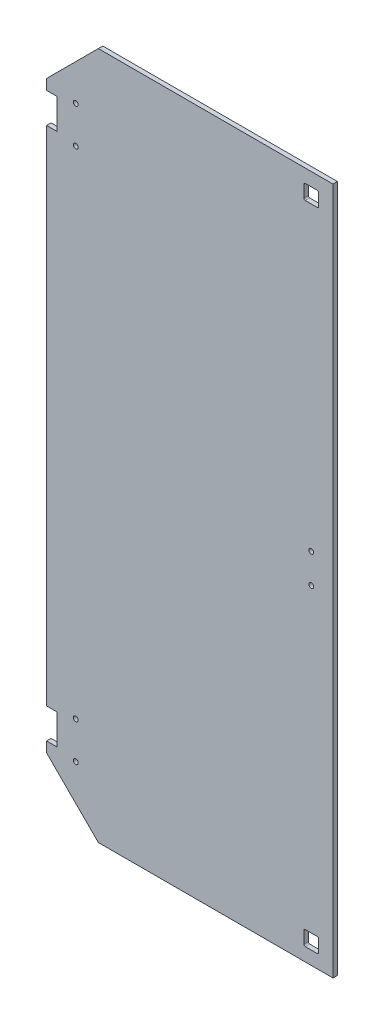
ISO-10303-21;
HEADER;
FILE_DESCRIPTION(('STEP AP214'),'2;1');
FILE_NAME('part.step','',(''),(''),'','','');
FILE_SCHEMA(('AUTOMOTIVE_DESIGN { 1 0 10303 214 1 1 1 1 }'));
ENDSEC;
DATA;
#1=APPLICATION_CONTEXT('core data for automotive mechanical design processes');
#2=APPLICATION_PROTOCOL_DEFINITION('international standard','automotive_design',2000,#1);
#3=PRODUCT_CONTEXT('',#1,'mechanical');
#4=PRODUCT('Part','Part','',(#3));
#5=PRODUCT_RELATED_PRODUCT_CATEGORY('part','',(#4));
#6=PRODUCT_DEFINITION_FORMATION('','',#4);
#7=PRODUCT_DEFINITION_CONTEXT('part definition',#1,'design');
#8=PRODUCT_DEFINITION('design','',#6,#7);
#9=PRODUCT_DEFINITION_SHAPE('','',#8);
#10=(LENGTH_UNIT() NAMED_UNIT(*) SI_UNIT(.MILLI.,.METRE.));
#11=(NAMED_UNIT(*) PLANE_ANGLE_UNIT() SI_UNIT($,.RADIAN.));
#12=(NAMED_UNIT(*) SI_UNIT($,.STERADIAN.) SOLID_ANGLE_UNIT());
#13=UNCERTAINTY_MEASURE_WITH_UNIT(LENGTH_MEASURE(1.E-05),#10,'distance_accuracy_value','');
#14=(GEOMETRIC_REPRESENTATION_CONTEXT(3) GLOBAL_UNCERTAINTY_ASSIGNED_CONTEXT((#13)) GLOBAL_UNIT_ASSIGNED_CONTEXT((#10,
#11,#12)) REPRESENTATION_CONTEXT('',''));
#15=CARTESIAN_POINT('',(0.,0.,0.));
#16=DIRECTION('',(0.,0.,1.));
#17=DIRECTION('',(1.,0.,0.));
#18=AXIS2_PLACEMENT_3D('',#15,#16,#17);
#19=CARTESIAN_POINT('',(0.,0.,3.));
#20=DIRECTION('',(0.,0.,1.));
#21=DIRECTION('',(1.,0.,0.));
#22=AXIS2_PLACEMENT_3D('',#19,#20,#21);
#23=PLANE('',#22);
#24=CARTESIAN_POINT('',(-11.,222.5,3.));
#25=DIRECTION('',(0.,0.,-1.));
#26=DIRECTION('',(1.,0.,0.));
#27=AXIS2_PLACEMENT_3D('',#24,#25,#26);
#28=CIRCLE('',#27,1.);
#29=CARTESIAN_POINT('',(-11.,223.5,3.));
#30=VERTEX_POINT('',#29);
#31=CARTESIAN_POINT('',(-10.,222.5,3.));
#32=VERTEX_POINT('',#31);
#33=EDGE_CURVE('E422',#30,#32,#28,.T.);
#34=ORIENTED_EDGE('',*,*,#33,.T.);
#35=DIRECTION('',(0.,-1.,0.));
#36=VECTOR('',#35,1.);
#37=CARTESIAN_POINT('',(-10.,222.5,3.));
#38=LINE('',#37,#36);
#39=CARTESIAN_POINT('',(-10.,214.5,3.));
#40=VERTEX_POINT('',#39);
#41=EDGE_CURVE('E418',#32,#40,#38,.T.);
#42=ORIENTED_EDGE('',*,*,#41,.T.);
#43=CARTESIAN_POINT('',(-11.,214.5,3.));
#44=DIRECTION('',(0.,0.,-1.));
#45=DIRECTION('',(1.,0.,0.));
#46=AXIS2_PLACEMENT_3D('',#43,#44,#45);
#47=CIRCLE('',#46,1.);
#48=CARTESIAN_POINT('',(-11.,213.5,3.));
#49=VERTEX_POINT('',#48);
#50=EDGE_CURVE('E444',#40,#49,#47,.T.);
#51=ORIENTED_EDGE('',*,*,#50,.T.);
#52=DIRECTION('',(-1.,0.,0.));
#53=VECTOR('',#52,1.);
#54=CARTESIAN_POINT('',(-11.,213.5,3.));
#55=LINE('',#54,#53);
#56=CARTESIAN_POINT('',(-19.,213.5,3.));
#57=VERTEX_POINT('',#56);
#58=EDGE_CURVE('E447',#49,#57,#55,.T.);
#59=ORIENTED_EDGE('',*,*,#58,.T.);
#60=CARTESIAN_POINT('',(-19.,214.5,3.));
#61=DIRECTION('',(0.,0.,-1.));
#62=DIRECTION('',(1.,0.,0.));
#63=AXIS2_PLACEMENT_3D('',#60,#61,#62);
#64=CIRCLE('',#63,1.);
#65=CARTESIAN_POINT('',(-20.,214.5,3.));
#66=VERTEX_POINT('',#65);
#67=EDGE_CURVE('E450',#57,#66,#64,.T.);
#68=ORIENTED_EDGE('',*,*,#67,.T.);
#69=DIRECTION('',(0.,1.,0.));
#70=VECTOR('',#69,1.);
#71=CARTESIAN_POINT('',(-20.,222.5,3.));
#72=LINE('',#71,#70);
#73=CARTESIAN_POINT('',(-20.,222.5,3.));
#74=VERTEX_POINT('',#73);
#75=EDGE_CURVE('E453',#66,#74,#72,.T.);
#76=ORIENTED_EDGE('',*,*,#75,.T.);
#77=CARTESIAN_POINT('',(-19.,222.5,3.));
#78=DIRECTION('',(0.,0.,-1.));
#79=DIRECTION('',(-1.,0.,0.));
#80=AXIS2_PLACEMENT_3D('',#77,#78,#79);
#81=CIRCLE('',#80,1.);
#82=CARTESIAN_POINT('',(-19.,223.5,3.));
#83=VERTEX_POINT('',#82);
#84=EDGE_CURVE('E456',#74,#83,#81,.T.);
#85=ORIENTED_EDGE('',*,*,#84,.T.);
#86=DIRECTION('',(1.,0.,0.));
#87=VECTOR('',#86,1.);
#88=CARTESIAN_POINT('',(-11.,223.5,3.));
#89=LINE('',#88,#87);
#90=EDGE_CURVE('E459',#83,#30,#89,.T.);
#91=ORIENTED_EDGE('',*,*,#90,.T.);
#92=EDGE_LOOP('',(#34,#42,#51,#59,#68,#76,#85,#91));
#93=FACE_BOUND('',#92,.T.);
#94=CARTESIAN_POINT('',(-15.,10.,3.));
#95=DIRECTION('',(0.,0.,1.));
#96=DIRECTION('',(1.,0.,0.));
#97=AXIS2_PLACEMENT_3D('',#94,#95,#96);
#98=CIRCLE('',#97,1.65);
#99=CARTESIAN_POINT('',(-13.35,10.,3.));
#100=VERTEX_POINT('',#99);
#101=EDGE_CURVE('E328',#100,#100,#98,.T.);
#102=ORIENTED_EDGE('',*,*,#101,.F.);
#103=EDGE_LOOP('',(#102));
#104=FACE_BOUND('',#103,.T.);
#105=CARTESIAN_POINT('',(-15.,-10.,3.));
#106=DIRECTION('',(0.,0.,1.));
#107=DIRECTION('',(1.,0.,0.));
#108=AXIS2_PLACEMENT_3D('',#105,#106,#107);
#109=CIRCLE('',#108,1.65);
#110=CARTESIAN_POINT('',(-13.35,-10.,3.));
#111=VERTEX_POINT('',#110);
#112=EDGE_CURVE('E334',#111,#111,#109,.T.);
#113=ORIENTED_EDGE('',*,*,#112,.F.);
#114=EDGE_LOOP('',(#113));
#115=FACE_BOUND('',#114,.T.);
#116=CARTESIAN_POINT('',(-174.25,-192.75,3.));
#117=DIRECTION('',(0.,0.,1.));
#118=DIRECTION('',(1.,0.,0.));
#119=AXIS2_PLACEMENT_3D('',#116,#117,#118);
#120=CIRCLE('',#119,1.65);
#121=CARTESIAN_POINT('',(-172.6,-192.75,3.));
#122=VERTEX_POINT('',#121);
#123=EDGE_CURVE('E310',#122,#122,#120,.T.);
#124=ORIENTED_EDGE('',*,*,#123,.F.);
#125=EDGE_LOOP('',(#124));
#126=FACE_BOUND('',#125,.T.);
#127=CARTESIAN_POINT('',(-174.25,192.75,3.));
#128=DIRECTION('',(0.,0.,1.));
#129=DIRECTION('',(-1.,0.,0.));
#130=AXIS2_PLACEMENT_3D('',#127,#128,#129);
#131=CIRCLE('',#130,1.65);
#132=CARTESIAN_POINT('',(-175.9,192.75,3.));
#133=VERTEX_POINT('',#132);
#134=EDGE_CURVE('E316',#133,#133,#131,.T.);
#135=ORIENTED_EDGE('',*,*,#134,.F.);
#136=EDGE_LOOP('',(#135));
#137=FACE_BOUND('',#136,.T.);
#138=CARTESIAN_POINT('',(-174.25,167.75,3.));
#139=DIRECTION('',(0.,0.,1.));
#140=DIRECTION('',(-1.,0.,0.));
#141=AXIS2_PLACEMENT_3D('',#138,#139,#140);
#142=CIRCLE('',#141,1.65);
#143=CARTESIAN_POINT('',(-175.9,167.75,3.));
#144=VERTEX_POINT('',#143);
#145=EDGE_CURVE('E317',#144,#144,#142,.T.);
#146=ORIENTED_EDGE('',*,*,#145,.F.);
#147=EDGE_LOOP('',(#146));
#148=FACE_BOUND('',#147,.T.);
#149=CARTESIAN_POINT('',(-174.25,-167.75,3.));
#150=DIRECTION('',(0.,0.,1.));
#151=DIRECTION('',(1.,0.,0.));
#152=AXIS2_PLACEMENT_3D('',#149,#150,#151);
#153=CIRCLE('',#152,1.65);
#154=CARTESIAN_POINT('',(-172.6,-167.75,3.));
#155=VERTEX_POINT('',#154);
#156=EDGE_CURVE('E304',#155,#155,#153,.T.);
#157=ORIENTED_EDGE('',*,*,#156,.F.);
#158=EDGE_LOOP('',(#157));
#159=FACE_BOUND('',#158,.T.);
#160=DIRECTION('',(0.,1.,0.));
#161=VECTOR('',#160,1.);
#162=CARTESIAN_POINT('',(-10.,-222.5,3.));
#163=LINE('',#162,#161);
#164=CARTESIAN_POINT('',(-10.,-222.5,3.));
#165=VERTEX_POINT('',#164);
#166=CARTESIAN_POINT('',(-10.,-214.5,3.));
#167=VERTEX_POINT('',#166);
#168=EDGE_CURVE('E399',#165,#167,#163,.T.);
#169=ORIENTED_EDGE('',*,*,#168,.F.);
#170=CARTESIAN_POINT('',(-11.,-222.5,3.));
#171=DIRECTION('',(0.,0.,1.));
#172=DIRECTION('',(1.,0.,0.));
#173=AXIS2_PLACEMENT_3D('',#170,#171,#172);
#174=CIRCLE('',#173,1.);
#175=CARTESIAN_POINT('',(-11.,-223.5,3.));
#176=VERTEX_POINT('',#175);
#177=EDGE_CURVE('E364',#176,#165,#174,.T.);
#178=ORIENTED_EDGE('',*,*,#177,.F.);
#179=DIRECTION('',(1.,0.,0.));
#180=VECTOR('',#179,1.);
#181=CARTESIAN_POINT('',(-11.,-223.5,3.));
#182=LINE('',#181,#180);
#183=CARTESIAN_POINT('',(-19.,-223.5,3.));
#184=VERTEX_POINT('',#183);
#185=EDGE_CURVE('E360',#184,#176,#182,.T.);
#186=ORIENTED_EDGE('',*,*,#185,.F.);
#187=CARTESIAN_POINT('',(-19.,-222.5,3.));
#188=DIRECTION('',(0.,0.,1.));
#189=DIRECTION('',(-1.,0.,0.));
#190=AXIS2_PLACEMENT_3D('',#187,#188,#189);
#191=CIRCLE('',#190,1.);
#192=CARTESIAN_POINT('',(-20.,-222.5,3.));
#193=VERTEX_POINT('',#192);
#194=EDGE_CURVE('E388',#193,#184,#191,.T.);
#195=ORIENTED_EDGE('',*,*,#194,.F.);
#196=DIRECTION('',(0.,-1.,0.));
#197=VECTOR('',#196,1.);
#198=CARTESIAN_POINT('',(-20.,-222.5,3.));
#199=LINE('',#198,#197);
#200=CARTESIAN_POINT('',(-20.,-214.5,3.));
#201=VERTEX_POINT('',#200);
#202=EDGE_CURVE('E391',#201,#193,#199,.T.);
#203=ORIENTED_EDGE('',*,*,#202,.F.);
#204=CARTESIAN_POINT('',(-19.,-214.5,3.));
#205=DIRECTION('',(0.,0.,1.));
#206=DIRECTION('',(1.,0.,0.));
#207=AXIS2_PLACEMENT_3D('',#204,#205,#206);
#208=CIRCLE('',#207,1.);
#209=CARTESIAN_POINT('',(-19.,-213.5,3.));
#210=VERTEX_POINT('',#209);
#211=EDGE_CURVE('E393',#210,#201,#208,.T.);
#212=ORIENTED_EDGE('',*,*,#211,.F.);
#213=DIRECTION('',(-1.,0.,0.));
#214=VECTOR('',#213,1.);
#215=CARTESIAN_POINT('',(-11.,-213.5,3.));
#216=LINE('',#215,#214);
#217=CARTESIAN_POINT('',(-11.,-213.5,3.));
#218=VERTEX_POINT('',#217);
#219=EDGE_CURVE('E395',#218,#210,#216,.T.);
#220=ORIENTED_EDGE('',*,*,#219,.F.);
#221=CARTESIAN_POINT('',(-11.,-214.5,3.));
#222=DIRECTION('',(0.,0.,1.));
#223=DIRECTION('',(1.,0.,0.));
#224=AXIS2_PLACEMENT_3D('',#221,#222,#223);
#225=CIRCLE('',#224,1.);
#226=EDGE_CURVE('E397',#167,#218,#225,.T.);
#227=ORIENTED_EDGE('',*,*,#226,.F.);
#228=EDGE_LOOP('',(#169,#178,#186,#195,#203,#212,#220,#227));
#229=FACE_BOUND('',#228,.T.);
#230=DIRECTION('',(0.,1.,0.));
#231=VECTOR('',#230,1.);
#232=CARTESIAN_POINT('',(-186.8,190.5,3.));
#233=LINE('',#232,#231);
#234=CARTESIAN_POINT('',(-186.8,170.,3.));
#235=VERTEX_POINT('',#234);
#236=CARTESIAN_POINT('',(-186.8,190.5,3.));
#237=VERTEX_POINT('',#236);
#238=EDGE_CURVE('E233',#235,#237,#233,.T.);
#239=ORIENTED_EDGE('',*,*,#238,.F.);
#240=DIRECTION('',(1.,0.,0.));
#241=VECTOR('',#240,1.);
#242=CARTESIAN_POINT('',(-194.,170.,3.));
#243=LINE('',#242,#241);
#244=CARTESIAN_POINT('',(-194.,170.,3.));
#245=VERTEX_POINT('',#244);
#246=EDGE_CURVE('E218',#245,#235,#243,.T.);
#247=ORIENTED_EDGE('',*,*,#246,.F.);
#248=DIRECTION('',(0.,-1.,0.));
#249=VECTOR('',#248,1.);
#250=CARTESIAN_POINT('',(-194.,-232.5,3.));
#251=LINE('',#250,#249);
#252=CARTESIAN_POINT('',(-194.,-170.,3.));
#253=VERTEX_POINT('',#252);
#254=EDGE_CURVE('E232',#245,#253,#251,.T.);
#255=ORIENTED_EDGE('',*,*,#254,.T.);
#256=DIRECTION('',(-1.,0.,0.));
#257=VECTOR('',#256,1.);
#258=CARTESIAN_POINT('',(-194.,-170.,3.));
#259=LINE('',#258,#257);
#260=CARTESIAN_POINT('',(-186.8,-170.,3.));
#261=VERTEX_POINT('',#260);
#262=EDGE_CURVE('E33',#261,#253,#259,.T.);
#263=ORIENTED_EDGE('',*,*,#262,.F.);
#264=DIRECTION('',(0.,1.,0.));
#265=VECTOR('',#264,1.);
#266=CARTESIAN_POINT('',(-186.8,-190.5,3.));
#267=LINE('',#266,#265);
#268=CARTESIAN_POINT('',(-186.8,-190.5,3.));
#269=VERTEX_POINT('',#268);
#270=EDGE_CURVE('E483',#269,#261,#267,.T.);
#271=ORIENTED_EDGE('',*,*,#270,.F.);
#272=DIRECTION('',(1.,0.,0.));
#273=VECTOR('',#272,1.);
#274=CARTESIAN_POINT('',(-194.,-190.5,3.));
#275=LINE('',#274,#273);
#276=CARTESIAN_POINT('',(-194.,-190.5,3.));
#277=VERTEX_POINT('',#276);
#278=EDGE_CURVE('E476',#277,#269,#275,.T.);
#279=ORIENTED_EDGE('',*,*,#278,.F.);
#280=CARTESIAN_POINT('',(-194.,-197.5,3.));
#281=VERTEX_POINT('',#280);
#282=EDGE_CURVE('E239',#277,#281,#251,.T.);
#283=ORIENTED_EDGE('',*,*,#282,.T.);
#284=DIRECTION('',(-0.707106781186547,0.707106781186549,0.));
#285=VECTOR('',#284,1.);
#286=CARTESIAN_POINT('',(-195.75,-195.75,3.));
#287=LINE('',#286,#285);
#288=CARTESIAN_POINT('',(-159.,-232.5,3.));
#289=VERTEX_POINT('',#288);
#290=EDGE_CURVE('E26',#281,#289,#287,.F.);
#291=ORIENTED_EDGE('',*,*,#290,.T.);
#292=DIRECTION('',(1.,0.,0.));
#293=VECTOR('',#292,1.);
#294=CARTESIAN_POINT('',(194.,-232.5,3.));
#295=LINE('',#294,#293);
#296=CARTESIAN_POINT('',(-0.299999999999967,-232.5,3.));
#297=VERTEX_POINT('',#296);
#298=EDGE_CURVE('E242',#289,#297,#295,.T.);
#299=ORIENTED_EDGE('',*,*,#298,.T.);
#300=DIRECTION('',(0.,-1.,0.));
#301=VECTOR('',#300,1.);
#302=CARTESIAN_POINT('',(-0.300000000000025,232.5,3.));
#303=LINE('',#302,#301);
#304=CARTESIAN_POINT('',(-0.300000000000025,232.5,3.));
#305=VERTEX_POINT('',#304);
#306=EDGE_CURVE('E303',#305,#297,#303,.T.);
#307=ORIENTED_EDGE('',*,*,#306,.F.);
#308=DIRECTION('',(-1.,0.,0.));
#309=VECTOR('',#308,1.);
#310=CARTESIAN_POINT('',(194.,232.5,3.));
#311=LINE('',#310,#309);
#312=CARTESIAN_POINT('',(-159.,232.5,3.));
#313=VERTEX_POINT('',#312);
#314=EDGE_CURVE('E249',#305,#313,#311,.T.);
#315=ORIENTED_EDGE('',*,*,#314,.T.);
#316=DIRECTION('',(0.707106781186549,0.707106781186547,0.));
#317=VECTOR('',#316,1.);
#318=CARTESIAN_POINT('',(-195.75,195.75,3.));
#319=LINE('',#318,#317);
#320=CARTESIAN_POINT('',(-194.,197.5,3.));
#321=VERTEX_POINT('',#320);
#322=EDGE_CURVE('E277',#313,#321,#319,.F.);
#323=ORIENTED_EDGE('',*,*,#322,.T.);
#324=CARTESIAN_POINT('',(-194.,190.5,3.));
#325=VERTEX_POINT('',#324);
#326=EDGE_CURVE('E238',#321,#325,#251,.T.);
#327=ORIENTED_EDGE('',*,*,#326,.T.);
#328=DIRECTION('',(-1.,0.,0.));
#329=VECTOR('',#328,1.);
#330=CARTESIAN_POINT('',(-194.,190.5,3.));
#331=LINE('',#330,#329);
#332=EDGE_CURVE('E41',#237,#325,#331,.T.);
#333=ORIENTED_EDGE('',*,*,#332,.F.);
#334=EDGE_LOOP('',(#239,#247,#255,#263,#271,#279,#283,#291,#299,#307,#315,#323,#327,#333));
#335=FACE_BOUND('',#334,.T.);
#336=ADVANCED_FACE('F17',(#93,#104,#115,#126,#137,#148,#159,#229,#335),#23,.T.);
#337=CARTESIAN_POINT('',(0.,0.,0.));
#338=DIRECTION('',(0.,0.,1.));
#339=DIRECTION('',(1.,0.,0.));
#340=AXIS2_PLACEMENT_3D('',#337,#338,#339);
#341=PLANE('',#340);
#342=DIRECTION('',(0.,-1.,0.));
#343=VECTOR('',#342,1.);
#344=CARTESIAN_POINT('',(-10.,222.5,0.));
#345=LINE('',#344,#343);
#346=CARTESIAN_POINT('',(-10.,222.5,0.));
#347=VERTEX_POINT('',#346);
#348=CARTESIAN_POINT('',(-10.,214.5,0.));
#349=VERTEX_POINT('',#348);
#350=EDGE_CURVE('E419',#347,#349,#345,.T.);
#351=ORIENTED_EDGE('',*,*,#350,.F.);
#352=CARTESIAN_POINT('',(-11.,222.5,0.));
#353=DIRECTION('',(0.,0.,-1.));
#354=DIRECTION('',(1.,0.,0.));
#355=AXIS2_PLACEMENT_3D('',#352,#353,#354);
#356=CIRCLE('',#355,1.);
#357=CARTESIAN_POINT('',(-11.,223.5,0.));
#358=VERTEX_POINT('',#357);
#359=EDGE_CURVE('E226',#358,#347,#356,.T.);
#360=ORIENTED_EDGE('',*,*,#359,.F.);
#361=DIRECTION('',(1.,0.,0.));
#362=VECTOR('',#361,1.);
#363=CARTESIAN_POINT('',(-11.,223.5,0.));
#364=LINE('',#363,#362);
#365=CARTESIAN_POINT('',(-19.,223.5,0.));
#366=VERTEX_POINT('',#365);
#367=EDGE_CURVE('E438',#366,#358,#364,.T.);
#368=ORIENTED_EDGE('',*,*,#367,.F.);
#369=CARTESIAN_POINT('',(-19.,222.5,0.));
#370=DIRECTION('',(0.,0.,-1.));
#371=DIRECTION('',(-1.,0.,0.));
#372=AXIS2_PLACEMENT_3D('',#369,#370,#371);
#373=CIRCLE('',#372,1.);
#374=CARTESIAN_POINT('',(-20.,222.5,0.));
#375=VERTEX_POINT('',#374);
#376=EDGE_CURVE('E435',#375,#366,#373,.T.);
#377=ORIENTED_EDGE('',*,*,#376,.F.);
#378=DIRECTION('',(0.,1.,0.));
#379=VECTOR('',#378,1.);
#380=CARTESIAN_POINT('',(-20.,222.5,0.));
#381=LINE('',#380,#379);
#382=CARTESIAN_POINT('',(-20.,214.5,0.));
#383=VERTEX_POINT('',#382);
#384=EDGE_CURVE('E432',#383,#375,#381,.T.);
#385=ORIENTED_EDGE('',*,*,#384,.F.);
#386=CARTESIAN_POINT('',(-19.,214.5,0.));
#387=DIRECTION('',(0.,0.,-1.));
#388=DIRECTION('',(1.,0.,0.));
#389=AXIS2_PLACEMENT_3D('',#386,#387,#388);
#390=CIRCLE('',#389,1.);
#391=CARTESIAN_POINT('',(-19.,213.5,0.));
#392=VERTEX_POINT('',#391);
#393=EDGE_CURVE('E429',#392,#383,#390,.T.);
#394=ORIENTED_EDGE('',*,*,#393,.F.);
#395=DIRECTION('',(-1.,0.,0.));
#396=VECTOR('',#395,1.);
#397=CARTESIAN_POINT('',(-11.,213.5,0.));
#398=LINE('',#397,#396);
#399=CARTESIAN_POINT('',(-11.,213.5,0.));
#400=VERTEX_POINT('',#399);
#401=EDGE_CURVE('E426',#400,#392,#398,.T.);
#402=ORIENTED_EDGE('',*,*,#401,.F.);
#403=CARTESIAN_POINT('',(-11.,214.5,0.));
#404=DIRECTION('',(0.,0.,-1.));
#405=DIRECTION('',(1.,0.,0.));
#406=AXIS2_PLACEMENT_3D('',#403,#404,#405);
#407=CIRCLE('',#406,1.);
#408=EDGE_CURVE('E423',#349,#400,#407,.T.);
#409=ORIENTED_EDGE('',*,*,#408,.F.);
#410=EDGE_LOOP('',(#351,#360,#368,#377,#385,#394,#402,#409));
#411=FACE_BOUND('',#410,.T.);
#412=CARTESIAN_POINT('',(-174.25,-167.75,0.));
#413=DIRECTION('',(0.,0.,1.));
#414=DIRECTION('',(1.,0.,0.));
#415=AXIS2_PLACEMENT_3D('',#412,#413,#414);
#416=CIRCLE('',#415,1.65);
#417=CARTESIAN_POINT('',(-172.6,-167.75,0.));
#418=VERTEX_POINT('',#417);
#419=EDGE_CURVE('E307',#418,#418,#416,.T.);
#420=ORIENTED_EDGE('',*,*,#419,.T.);
#421=EDGE_LOOP('',(#420));
#422=FACE_BOUND('',#421,.T.);
#423=CARTESIAN_POINT('',(-174.25,167.75,0.));
#424=DIRECTION('',(0.,0.,1.));
#425=DIRECTION('',(-1.,0.,0.));
#426=AXIS2_PLACEMENT_3D('',#423,#424,#425);
#427=CIRCLE('',#426,1.65);
#428=CARTESIAN_POINT('',(-175.9,167.75,0.));
#429=VERTEX_POINT('',#428);
#430=EDGE_CURVE('E325',#429,#429,#427,.T.);
#431=ORIENTED_EDGE('',*,*,#430,.T.);
#432=EDGE_LOOP('',(#431));
#433=FACE_BOUND('',#432,.T.);
#434=CARTESIAN_POINT('',(-174.25,192.75,0.));
#435=DIRECTION('',(0.,0.,1.));
#436=DIRECTION('',(-1.,0.,0.));
#437=AXIS2_PLACEMENT_3D('',#434,#435,#436);
#438=CIRCLE('',#437,1.65);
#439=CARTESIAN_POINT('',(-175.9,192.75,0.));
#440=VERTEX_POINT('',#439);
#441=EDGE_CURVE('E313',#440,#440,#438,.T.);
#442=ORIENTED_EDGE('',*,*,#441,.T.);
#443=EDGE_LOOP('',(#442));
#444=FACE_BOUND('',#443,.T.);
#445=CARTESIAN_POINT('',(-174.25,-192.75,0.));
#446=DIRECTION('',(0.,0.,1.));
#447=DIRECTION('',(1.,0.,0.));
#448=AXIS2_PLACEMENT_3D('',#445,#446,#447);
#449=CIRCLE('',#448,1.65);
#450=CARTESIAN_POINT('',(-172.6,-192.75,0.));
#451=VERTEX_POINT('',#450);
#452=EDGE_CURVE('E320',#451,#451,#449,.T.);
#453=ORIENTED_EDGE('',*,*,#452,.T.);
#454=EDGE_LOOP('',(#453));
#455=FACE_BOUND('',#454,.T.);
#456=CARTESIAN_POINT('',(-15.,-10.,0.));
#457=DIRECTION('',(0.,0.,1.));
#458=DIRECTION('',(1.,0.,0.));
#459=AXIS2_PLACEMENT_3D('',#456,#457,#458);
#460=CIRCLE('',#459,1.65);
#461=CARTESIAN_POINT('',(-13.35,-10.,0.));
#462=VERTEX_POINT('',#461);
#463=EDGE_CURVE('E331',#462,#462,#460,.T.);
#464=ORIENTED_EDGE('',*,*,#463,.T.);
#465=EDGE_LOOP('',(#464));
#466=FACE_BOUND('',#465,.T.);
#467=CARTESIAN_POINT('',(-15.,10.,0.));
#468=DIRECTION('',(0.,0.,1.));
#469=DIRECTION('',(1.,0.,0.));
#470=AXIS2_PLACEMENT_3D('',#467,#468,#469);
#471=CIRCLE('',#470,1.65);
#472=CARTESIAN_POINT('',(-13.35,10.,0.));
#473=VERTEX_POINT('',#472);
#474=EDGE_CURVE('E338',#473,#473,#471,.T.);
#475=ORIENTED_EDGE('',*,*,#474,.T.);
#476=EDGE_LOOP('',(#475));
#477=FACE_BOUND('',#476,.T.);
#478=CARTESIAN_POINT('',(-11.,-222.5,0.));
#479=DIRECTION('',(0.,0.,1.));
#480=DIRECTION('',(1.,0.,0.));
#481=AXIS2_PLACEMENT_3D('',#478,#479,#480);
#482=CIRCLE('',#481,1.);
#483=CARTESIAN_POINT('',(-11.,-223.5,0.));
#484=VERTEX_POINT('',#483);
#485=CARTESIAN_POINT('',(-10.,-222.5,0.));
#486=VERTEX_POINT('',#485);
#487=EDGE_CURVE('E383',#484,#486,#482,.T.);
#488=ORIENTED_EDGE('',*,*,#487,.T.);
#489=DIRECTION('',(0.,1.,0.));
#490=VECTOR('',#489,1.);
#491=CARTESIAN_POINT('',(-10.,-222.5,0.));
#492=LINE('',#491,#490);
#493=CARTESIAN_POINT('',(-10.,-214.5,0.));
#494=VERTEX_POINT('',#493);
#495=EDGE_CURVE('E380',#486,#494,#492,.T.);
#496=ORIENTED_EDGE('',*,*,#495,.T.);
#497=CARTESIAN_POINT('',(-11.,-214.5,0.));
#498=DIRECTION('',(0.,0.,1.));
#499=DIRECTION('',(1.,0.,0.));
#500=AXIS2_PLACEMENT_3D('',#497,#498,#499);
#501=CIRCLE('',#500,1.);
#502=CARTESIAN_POINT('',(-11.,-213.5,0.));
#503=VERTEX_POINT('',#502);
#504=EDGE_CURVE('E377',#494,#503,#501,.T.);
#505=ORIENTED_EDGE('',*,*,#504,.T.);
#506=DIRECTION('',(-1.,0.,0.));
#507=VECTOR('',#506,1.);
#508=CARTESIAN_POINT('',(-11.,-213.5,0.));
#509=LINE('',#508,#507);
#510=CARTESIAN_POINT('',(-19.,-213.5,0.));
#511=VERTEX_POINT('',#510);
#512=EDGE_CURVE('E374',#503,#511,#509,.T.);
#513=ORIENTED_EDGE('',*,*,#512,.T.);
#514=CARTESIAN_POINT('',(-19.,-214.5,0.));
#515=DIRECTION('',(0.,0.,1.));
#516=DIRECTION('',(1.,0.,0.));
#517=AXIS2_PLACEMENT_3D('',#514,#515,#516);
#518=CIRCLE('',#517,1.);
#519=CARTESIAN_POINT('',(-20.,-214.5,0.));
#520=VERTEX_POINT('',#519);
#521=EDGE_CURVE('E371',#511,#520,#518,.T.);
#522=ORIENTED_EDGE('',*,*,#521,.T.);
#523=DIRECTION('',(0.,-1.,0.));
#524=VECTOR('',#523,1.);
#525=CARTESIAN_POINT('',(-20.,-222.5,0.));
#526=LINE('',#525,#524);
#527=CARTESIAN_POINT('',(-20.,-222.5,0.));
#528=VERTEX_POINT('',#527);
#529=EDGE_CURVE('E368',#520,#528,#526,.T.);
#530=ORIENTED_EDGE('',*,*,#529,.T.);
#531=CARTESIAN_POINT('',(-19.,-222.5,0.));
#532=DIRECTION('',(0.,0.,1.));
#533=DIRECTION('',(-1.,0.,0.));
#534=AXIS2_PLACEMENT_3D('',#531,#532,#533);
#535=CIRCLE('',#534,1.);
#536=CARTESIAN_POINT('',(-19.,-223.5,0.));
#537=VERTEX_POINT('',#536);
#538=EDGE_CURVE('E365',#528,#537,#535,.T.);
#539=ORIENTED_EDGE('',*,*,#538,.T.);
#540=DIRECTION('',(1.,0.,0.));
#541=VECTOR('',#540,1.);
#542=CARTESIAN_POINT('',(-11.,-223.5,0.));
#543=LINE('',#542,#541);
#544=EDGE_CURVE('E361',#537,#484,#543,.T.);
#545=ORIENTED_EDGE('',*,*,#544,.T.);
#546=EDGE_LOOP('',(#488,#496,#505,#513,#522,#530,#539,#545));
#547=FACE_BOUND('',#546,.T.);
#548=DIRECTION('',(1.,0.,0.));
#549=VECTOR('',#548,1.);
#550=CARTESIAN_POINT('',(-194.,170.,0.));
#551=LINE('',#550,#549);
#552=CARTESIAN_POINT('',(-194.,170.,0.));
#553=VERTEX_POINT('',#552);
#554=CARTESIAN_POINT('',(-186.8,170.,0.));
#555=VERTEX_POINT('',#554);
#556=EDGE_CURVE('E221',#553,#555,#551,.T.);
#557=ORIENTED_EDGE('',*,*,#556,.T.);
#558=DIRECTION('',(0.,1.,0.));
#559=VECTOR('',#558,1.);
#560=CARTESIAN_POINT('',(-186.8,190.5,0.));
#561=LINE('',#560,#559);
#562=CARTESIAN_POINT('',(-186.8,190.5,0.));
#563=VERTEX_POINT('',#562);
#564=EDGE_CURVE('E493',#555,#563,#561,.T.);
#565=ORIENTED_EDGE('',*,*,#564,.T.);
#566=DIRECTION('',(-1.,0.,0.));
#567=VECTOR('',#566,1.);
#568=CARTESIAN_POINT('',(-194.,190.5,0.));
#569=LINE('',#568,#567);
#570=CARTESIAN_POINT('',(-194.,190.5,0.));
#571=VERTEX_POINT('',#570);
#572=EDGE_CURVE('E234',#563,#571,#569,.T.);
#573=ORIENTED_EDGE('',*,*,#572,.T.);
#574=DIRECTION('',(0.,-1.,0.));
#575=VECTOR('',#574,1.);
#576=CARTESIAN_POINT('',(-194.,-232.5,0.));
#577=LINE('',#576,#575);
#578=CARTESIAN_POINT('',(-194.,197.5,0.));
#579=VERTEX_POINT('',#578);
#580=EDGE_CURVE('E253',#579,#571,#577,.T.);
#581=ORIENTED_EDGE('',*,*,#580,.F.);
#582=DIRECTION('',(-0.707106781186549,-0.707106781186547,0.));
#583=VECTOR('',#582,1.);
#584=CARTESIAN_POINT('',(-194.,197.5,0.));
#585=LINE('',#584,#583);
#586=CARTESIAN_POINT('',(-159.,232.5,0.));
#587=VERTEX_POINT('',#586);
#588=EDGE_CURVE('E266',#579,#587,#585,.F.);
#589=ORIENTED_EDGE('',*,*,#588,.T.);
#590=DIRECTION('',(-1.,0.,0.));
#591=VECTOR('',#590,1.);
#592=CARTESIAN_POINT('',(194.,232.5,0.));
#593=LINE('',#592,#591);
#594=CARTESIAN_POINT('',(-0.300000000000025,232.5,0.));
#595=VERTEX_POINT('',#594);
#596=EDGE_CURVE('E243',#595,#587,#593,.T.);
#597=ORIENTED_EDGE('',*,*,#596,.F.);
#598=DIRECTION('',(0.,1.,0.));
#599=VECTOR('',#598,1.);
#600=CARTESIAN_POINT('',(-0.299999999999996,0.,0.));
#601=LINE('',#600,#599);
#602=CARTESIAN_POINT('',(-0.299999999999912,-232.5,0.));
#603=VERTEX_POINT('',#602);
#604=EDGE_CURVE('E252',#603,#595,#601,.T.);
#605=ORIENTED_EDGE('',*,*,#604,.F.);
#606=DIRECTION('',(1.,0.,0.));
#607=VECTOR('',#606,1.);
#608=CARTESIAN_POINT('',(194.,-232.5,0.));
#609=LINE('',#608,#607);
#610=CARTESIAN_POINT('',(-159.,-232.5,0.));
#611=VERTEX_POINT('',#610);
#612=EDGE_CURVE('E256',#611,#603,#609,.T.);
#613=ORIENTED_EDGE('',*,*,#612,.F.);
#614=DIRECTION('',(0.707106781186547,-0.707106781186549,0.));
#615=VECTOR('',#614,1.);
#616=CARTESIAN_POINT('',(-159.,-232.5,0.));
#617=LINE('',#616,#615);
#618=CARTESIAN_POINT('',(-194.,-197.5,0.));
#619=VERTEX_POINT('',#618);
#620=EDGE_CURVE('E268',#611,#619,#617,.F.);
#621=ORIENTED_EDGE('',*,*,#620,.T.);
#622=CARTESIAN_POINT('',(-194.,-190.5,0.));
#623=VERTEX_POINT('',#622);
#624=EDGE_CURVE('E258',#623,#619,#577,.T.);
#625=ORIENTED_EDGE('',*,*,#624,.F.);
#626=DIRECTION('',(1.,0.,0.));
#627=VECTOR('',#626,1.);
#628=CARTESIAN_POINT('',(-194.,-190.5,0.));
#629=LINE('',#628,#627);
#630=CARTESIAN_POINT('',(-186.8,-190.5,0.));
#631=VERTEX_POINT('',#630);
#632=EDGE_CURVE('E480',#623,#631,#629,.T.);
#633=ORIENTED_EDGE('',*,*,#632,.T.);
#634=DIRECTION('',(0.,1.,0.));
#635=VECTOR('',#634,1.);
#636=CARTESIAN_POINT('',(-186.8,-190.5,0.));
#637=LINE('',#636,#635);
#638=CARTESIAN_POINT('',(-186.8,-170.,0.));
#639=VERTEX_POINT('',#638);
#640=EDGE_CURVE('E477',#631,#639,#637,.T.);
#641=ORIENTED_EDGE('',*,*,#640,.T.);
#642=DIRECTION('',(-1.,0.,0.));
#643=VECTOR('',#642,1.);
#644=CARTESIAN_POINT('',(-194.,-170.,0.));
#645=LINE('',#644,#643);
#646=CARTESIAN_POINT('',(-194.,-170.,0.));
#647=VERTEX_POINT('',#646);
#648=EDGE_CURVE('E473',#639,#647,#645,.T.);
#649=ORIENTED_EDGE('',*,*,#648,.T.);
#650=EDGE_CURVE('E257',#553,#647,#577,.T.);
#651=ORIENTED_EDGE('',*,*,#650,.F.);
#652=EDGE_LOOP('',(#557,#565,#573,#581,#589,#597,#605,#613,#621,#625,#633,#641,#649,#651));
#653=FACE_BOUND('',#652,.T.);
#654=ADVANCED_FACE('F296',(#411,#422,#433,#444,#455,#466,#477,#547,#653),#341,.F.);
#655=CARTESIAN_POINT('',(-194.,-232.5,3.));
#656=DIRECTION('',(1.,0.,0.));
#657=DIRECTION('',(0.,1.,0.));
#658=AXIS2_PLACEMENT_3D('',#655,#656,#657);
#659=PLANE('',#658);
#660=DIRECTION('',(0.,0.,-1.));
#661=VECTOR('',#660,1.);
#662=CARTESIAN_POINT('',(-194.,170.,3.));
#663=LINE('',#662,#661);
#664=EDGE_CURVE('E215',#245,#553,#663,.T.);
#665=ORIENTED_EDGE('',*,*,#664,.T.);
#666=ORIENTED_EDGE('',*,*,#650,.T.);
#667=DIRECTION('',(0.,0.,-1.));
#668=VECTOR('',#667,1.);
#669=CARTESIAN_POINT('',(-194.,-170.,3.));
#670=LINE('',#669,#668);
#671=EDGE_CURVE('E237',#253,#647,#670,.T.);
#672=ORIENTED_EDGE('',*,*,#671,.F.);
#673=ORIENTED_EDGE('',*,*,#254,.F.);
#674=EDGE_LOOP('',(#665,#666,#672,#673));
#675=FACE_BOUND('',#674,.T.);
#676=ADVANCED_FACE('F236',(#675),#659,.F.);
#677=DIRECTION('',(0.,0.,-1.));
#678=VECTOR('',#677,1.);
#679=CARTESIAN_POINT('',(-194.,190.5,3.));
#680=LINE('',#679,#678);
#681=EDGE_CURVE('E489',#325,#571,#680,.T.);
#682=ORIENTED_EDGE('',*,*,#681,.F.);
#683=ORIENTED_EDGE('',*,*,#326,.F.);
#684=DIRECTION('',(0.,0.,-1.));
#685=VECTOR('',#684,1.);
#686=CARTESIAN_POINT('',(-194.,197.5,3.));
#687=LINE('',#686,#685);
#688=EDGE_CURVE('E271',#321,#579,#687,.T.);
#689=ORIENTED_EDGE('',*,*,#688,.T.);
#690=ORIENTED_EDGE('',*,*,#580,.T.);
#691=EDGE_LOOP('',(#682,#683,#689,#690));
#692=FACE_BOUND('',#691,.T.);
#693=ADVANCED_FACE('F507',(#692),#659,.F.);
#694=DIRECTION('',(0.,0.,-1.));
#695=VECTOR('',#694,1.);
#696=CARTESIAN_POINT('',(-194.,-190.5,3.));
#697=LINE('',#696,#695);
#698=EDGE_CURVE('E470',#277,#623,#697,.T.);
#699=ORIENTED_EDGE('',*,*,#698,.T.);
#700=ORIENTED_EDGE('',*,*,#624,.T.);
#701=DIRECTION('',(0.,0.,1.));
#702=VECTOR('',#701,1.);
#703=CARTESIAN_POINT('',(-194.,-197.5,3.));
#704=LINE('',#703,#702);
#705=EDGE_CURVE('E274',#619,#281,#704,.T.);
#706=ORIENTED_EDGE('',*,*,#705,.T.);
#707=ORIENTED_EDGE('',*,*,#282,.F.);
#708=EDGE_LOOP('',(#699,#700,#706,#707));
#709=FACE_BOUND('',#708,.T.);
#710=ADVANCED_FACE('F523',(#709),#659,.F.);
#711=CARTESIAN_POINT('',(194.,-232.5,3.));
#712=DIRECTION('',(0.,1.,0.));
#713=DIRECTION('',(-1.,0.,0.));
#714=AXIS2_PLACEMENT_3D('',#711,#712,#713);
#715=PLANE('',#714);
#716=ORIENTED_EDGE('',*,*,#298,.F.);
#717=DIRECTION('',(0.,0.,-1.));
#718=VECTOR('',#717,1.);
#719=CARTESIAN_POINT('',(-159.,-232.5,3.));
#720=LINE('',#719,#718);
#721=EDGE_CURVE('E263',#289,#611,#720,.T.);
#722=ORIENTED_EDGE('',*,*,#721,.T.);
#723=ORIENTED_EDGE('',*,*,#612,.T.);
#724=DIRECTION('',(0.,0.,-1.));
#725=VECTOR('',#724,1.);
#726=CARTESIAN_POINT('',(-0.299999999999967,-232.5,3.));
#727=LINE('',#726,#725);
#728=EDGE_CURVE('E292',#297,#603,#727,.T.);
#729=ORIENTED_EDGE('',*,*,#728,.F.);
#730=EDGE_LOOP('',(#716,#722,#723,#729));
#731=FACE_BOUND('',#730,.T.);
#732=ADVANCED_FACE('F289',(#731),#715,.F.);
#733=CARTESIAN_POINT('',(194.,232.5,3.));
#734=DIRECTION('',(0.,-1.,0.));
#735=DIRECTION('',(1.,0.,0.));
#736=AXIS2_PLACEMENT_3D('',#733,#734,#735);
#737=PLANE('',#736);
#738=ORIENTED_EDGE('',*,*,#596,.T.);
#739=DIRECTION('',(0.,0.,1.));
#740=VECTOR('',#739,1.);
#741=CARTESIAN_POINT('',(-159.,232.5,3.));
#742=LINE('',#741,#740);
#743=EDGE_CURVE('E11',#587,#313,#742,.T.);
#744=ORIENTED_EDGE('',*,*,#743,.T.);
#745=ORIENTED_EDGE('',*,*,#314,.F.);
#746=DIRECTION('',(0.,0.,-1.));
#747=VECTOR('',#746,1.);
#748=CARTESIAN_POINT('',(-0.300000000000025,232.5,3.));
#749=LINE('',#748,#747);
#750=EDGE_CURVE('E246',#305,#595,#749,.T.);
#751=ORIENTED_EDGE('',*,*,#750,.T.);
#752=EDGE_LOOP('',(#738,#744,#745,#751));
#753=FACE_BOUND('',#752,.T.);
#754=ADVANCED_FACE('F512',(#753),#737,.F.);
#755=CARTESIAN_POINT('',(-0.300000000000025,232.5,3.));
#756=DIRECTION('',(1.,0.,0.));
#757=DIRECTION('',(0.,1.,0.));
#758=AXIS2_PLACEMENT_3D('',#755,#756,#757);
#759=PLANE('',#758);
#760=ORIENTED_EDGE('',*,*,#604,.T.);
#761=ORIENTED_EDGE('',*,*,#750,.F.);
#762=ORIENTED_EDGE('',*,*,#306,.T.);
#763=ORIENTED_EDGE('',*,*,#728,.T.);
#764=EDGE_LOOP('',(#760,#761,#762,#763));
#765=FACE_BOUND('',#764,.T.);
#766=ADVANCED_FACE('F301',(#765),#759,.T.);
#767=CARTESIAN_POINT('',(-159.,-232.5,3.));
#768=DIRECTION('',(0.707106781186549,0.707106781186547,0.));
#769=DIRECTION('',(0.,0.,-1.));
#770=AXIS2_PLACEMENT_3D('',#767,#768,#769);
#771=PLANE('',#770);
#772=ORIENTED_EDGE('',*,*,#290,.F.);
#773=ORIENTED_EDGE('',*,*,#705,.F.);
#774=ORIENTED_EDGE('',*,*,#620,.F.);
#775=ORIENTED_EDGE('',*,*,#721,.F.);
#776=EDGE_LOOP('',(#772,#773,#774,#775));
#777=FACE_BOUND('',#776,.T.);
#778=ADVANCED_FACE('F293',(#777),#771,.F.);
#779=CARTESIAN_POINT('',(-194.,197.5,3.));
#780=DIRECTION('',(0.707106781186547,-0.707106781186549,0.));
#781=DIRECTION('',(0.,0.,-1.));
#782=AXIS2_PLACEMENT_3D('',#779,#780,#781);
#783=PLANE('',#782);
#784=ORIENTED_EDGE('',*,*,#322,.F.);
#785=ORIENTED_EDGE('',*,*,#743,.F.);
#786=ORIENTED_EDGE('',*,*,#588,.F.);
#787=ORIENTED_EDGE('',*,*,#688,.F.);
#788=EDGE_LOOP('',(#784,#785,#786,#787));
#789=FACE_BOUND('',#788,.T.);
#790=ADVANCED_FACE('F20',(#789),#783,.F.);
#791=CARTESIAN_POINT('',(-174.25,-167.75,3.));
#792=DIRECTION('',(0.,0.,-1.));
#793=DIRECTION('',(-1.,0.,0.));
#794=AXIS2_PLACEMENT_3D('',#791,#792,#793);
#795=CYLINDRICAL_SURFACE('',#794,1.65);
#796=ORIENTED_EDGE('',*,*,#156,.T.);
#797=EDGE_LOOP('',(#796));
#798=FACE_BOUND('',#797,.T.);
#799=ORIENTED_EDGE('',*,*,#419,.F.);
#800=EDGE_LOOP('',(#799));
#801=FACE_BOUND('',#800,.T.);
#802=ADVANCED_FACE('F536',(#798,#801),#795,.F.);
#803=CARTESIAN_POINT('',(-174.25,167.75,3.));
#804=DIRECTION('',(0.,0.,-1.));
#805=DIRECTION('',(-1.,0.,0.));
#806=AXIS2_PLACEMENT_3D('',#803,#804,#805);
#807=CYLINDRICAL_SURFACE('',#806,1.65);
#808=ORIENTED_EDGE('',*,*,#145,.T.);
#809=EDGE_LOOP('',(#808));
#810=FACE_BOUND('',#809,.T.);
#811=ORIENTED_EDGE('',*,*,#430,.F.);
#812=EDGE_LOOP('',(#811));
#813=FACE_BOUND('',#812,.T.);
#814=ADVANCED_FACE('F539',(#810,#813),#807,.F.);
#815=CARTESIAN_POINT('',(-174.25,192.75,3.));
#816=DIRECTION('',(0.,0.,-1.));
#817=DIRECTION('',(-1.,0.,0.));
#818=AXIS2_PLACEMENT_3D('',#815,#816,#817);
#819=CYLINDRICAL_SURFACE('',#818,1.65);
#820=ORIENTED_EDGE('',*,*,#134,.T.);
#821=EDGE_LOOP('',(#820));
#822=FACE_BOUND('',#821,.T.);
#823=ORIENTED_EDGE('',*,*,#441,.F.);
#824=EDGE_LOOP('',(#823));
#825=FACE_BOUND('',#824,.T.);
#826=ADVANCED_FACE('F541',(#822,#825),#819,.F.);
#827=CARTESIAN_POINT('',(-174.25,-192.75,3.));
#828=DIRECTION('',(0.,0.,-1.));
#829=DIRECTION('',(-1.,0.,0.));
#830=AXIS2_PLACEMENT_3D('',#827,#828,#829);
#831=CYLINDRICAL_SURFACE('',#830,1.65);
#832=ORIENTED_EDGE('',*,*,#123,.T.);
#833=EDGE_LOOP('',(#832));
#834=FACE_BOUND('',#833,.T.);
#835=ORIENTED_EDGE('',*,*,#452,.F.);
#836=EDGE_LOOP('',(#835));
#837=FACE_BOUND('',#836,.T.);
#838=ADVANCED_FACE('F544',(#834,#837),#831,.F.);
#839=CARTESIAN_POINT('',(-15.,-10.,3.));
#840=DIRECTION('',(0.,0.,-1.));
#841=DIRECTION('',(-1.,0.,0.));
#842=AXIS2_PLACEMENT_3D('',#839,#840,#841);
#843=CYLINDRICAL_SURFACE('',#842,1.65);
#844=ORIENTED_EDGE('',*,*,#112,.T.);
#845=EDGE_LOOP('',(#844));
#846=FACE_BOUND('',#845,.T.);
#847=ORIENTED_EDGE('',*,*,#463,.F.);
#848=EDGE_LOOP('',(#847));
#849=FACE_BOUND('',#848,.T.);
#850=ADVANCED_FACE('F548',(#846,#849),#843,.F.);
#851=CARTESIAN_POINT('',(-15.,10.,3.));
#852=DIRECTION('',(0.,0.,-1.));
#853=DIRECTION('',(-1.,0.,0.));
#854=AXIS2_PLACEMENT_3D('',#851,#852,#853);
#855=CYLINDRICAL_SURFACE('',#854,1.65);
#856=ORIENTED_EDGE('',*,*,#101,.T.);
#857=EDGE_LOOP('',(#856));
#858=FACE_BOUND('',#857,.T.);
#859=ORIENTED_EDGE('',*,*,#474,.F.);
#860=EDGE_LOOP('',(#859));
#861=FACE_BOUND('',#860,.T.);
#862=ADVANCED_FACE('F555',(#858,#861),#855,.F.);
#863=CARTESIAN_POINT('',(-11.,-222.5,3.));
#864=DIRECTION('',(0.,0.,-1.));
#865=DIRECTION('',(-1.,0.,0.));
#866=AXIS2_PLACEMENT_3D('',#863,#864,#865);
#867=CYLINDRICAL_SURFACE('',#866,1.);
#868=ORIENTED_EDGE('',*,*,#487,.F.);
#869=DIRECTION('',(0.,0.,-1.));
#870=VECTOR('',#869,1.);
#871=CARTESIAN_POINT('',(-11.,-223.5,3.));
#872=LINE('',#871,#870);
#873=EDGE_CURVE('E357',#176,#484,#872,.T.);
#874=ORIENTED_EDGE('',*,*,#873,.F.);
#875=ORIENTED_EDGE('',*,*,#177,.T.);
#876=DIRECTION('',(0.,0.,-1.));
#877=VECTOR('',#876,1.);
#878=CARTESIAN_POINT('',(-10.,-222.5,3.));
#879=LINE('',#878,#877);
#880=EDGE_CURVE('E335',#165,#486,#879,.T.);
#881=ORIENTED_EDGE('',*,*,#880,.T.);
#882=EDGE_LOOP('',(#868,#874,#875,#881));
#883=FACE_BOUND('',#882,.T.);
#884=ADVANCED_FACE('F559',(#883),#867,.F.);
#885=CARTESIAN_POINT('',(-10.,-222.5,3.));
#886=DIRECTION('',(-1.,0.,0.));
#887=DIRECTION('',(0.,0.,1.));
#888=AXIS2_PLACEMENT_3D('',#885,#886,#887);
#889=PLANE('',#888);
#890=ORIENTED_EDGE('',*,*,#495,.F.);
#891=ORIENTED_EDGE('',*,*,#880,.F.);
#892=ORIENTED_EDGE('',*,*,#168,.T.);
#893=DIRECTION('',(0.,0.,-1.));
#894=VECTOR('',#893,1.);
#895=CARTESIAN_POINT('',(-10.,-214.5,3.));
#896=LINE('',#895,#894);
#897=EDGE_CURVE('E345',#167,#494,#896,.T.);
#898=ORIENTED_EDGE('',*,*,#897,.T.);
#899=EDGE_LOOP('',(#890,#891,#892,#898));
#900=FACE_BOUND('',#899,.T.);
#901=ADVANCED_FACE('F563',(#900),#889,.T.);
#902=CARTESIAN_POINT('',(-11.,-214.5,3.));
#903=DIRECTION('',(0.,0.,-1.));
#904=DIRECTION('',(-1.,0.,0.));
#905=AXIS2_PLACEMENT_3D('',#902,#903,#904);
#906=CYLINDRICAL_SURFACE('',#905,1.);
#907=ORIENTED_EDGE('',*,*,#504,.F.);
#908=ORIENTED_EDGE('',*,*,#897,.F.);
#909=ORIENTED_EDGE('',*,*,#226,.T.);
#910=DIRECTION('',(0.,0.,-1.));
#911=VECTOR('',#910,1.);
#912=CARTESIAN_POINT('',(-11.,-213.5,3.));
#913=LINE('',#912,#911);
#914=EDGE_CURVE('E347',#218,#503,#913,.T.);
#915=ORIENTED_EDGE('',*,*,#914,.T.);
#916=EDGE_LOOP('',(#907,#908,#909,#915));
#917=FACE_BOUND('',#916,.T.);
#918=ADVANCED_FACE('F567',(#917),#906,.F.);
#919=CARTESIAN_POINT('',(-11.,-213.5,3.));
#920=DIRECTION('',(0.,-1.,0.));
#921=DIRECTION('',(0.,0.,-1.));
#922=AXIS2_PLACEMENT_3D('',#919,#920,#921);
#923=PLANE('',#922);
#924=ORIENTED_EDGE('',*,*,#512,.F.);
#925=ORIENTED_EDGE('',*,*,#914,.F.);
#926=ORIENTED_EDGE('',*,*,#219,.T.);
#927=DIRECTION('',(0.,0.,-1.));
#928=VECTOR('',#927,1.);
#929=CARTESIAN_POINT('',(-19.,-213.5,3.));
#930=LINE('',#929,#928);
#931=EDGE_CURVE('E349',#210,#511,#930,.T.);
#932=ORIENTED_EDGE('',*,*,#931,.T.);
#933=EDGE_LOOP('',(#924,#925,#926,#932));
#934=FACE_BOUND('',#933,.T.);
#935=ADVANCED_FACE('F571',(#934),#923,.T.);
#936=CARTESIAN_POINT('',(-19.,-214.5,3.));
#937=DIRECTION('',(0.,0.,-1.));
#938=DIRECTION('',(-1.,0.,0.));
#939=AXIS2_PLACEMENT_3D('',#936,#937,#938);
#940=CYLINDRICAL_SURFACE('',#939,1.);
#941=ORIENTED_EDGE('',*,*,#521,.F.);
#942=ORIENTED_EDGE('',*,*,#931,.F.);
#943=ORIENTED_EDGE('',*,*,#211,.T.);
#944=DIRECTION('',(0.,0.,-1.));
#945=VECTOR('',#944,1.);
#946=CARTESIAN_POINT('',(-20.,-214.5,3.));
#947=LINE('',#946,#945);
#948=EDGE_CURVE('E351',#201,#520,#947,.T.);
#949=ORIENTED_EDGE('',*,*,#948,.T.);
#950=EDGE_LOOP('',(#941,#942,#943,#949));
#951=FACE_BOUND('',#950,.T.);
#952=ADVANCED_FACE('F575',(#951),#940,.F.);
#953=CARTESIAN_POINT('',(-20.,-222.5,3.));
#954=DIRECTION('',(1.,0.,0.));
#955=DIRECTION('',(0.,0.,-1.));
#956=AXIS2_PLACEMENT_3D('',#953,#954,#955);
#957=PLANE('',#956);
#958=ORIENTED_EDGE('',*,*,#529,.F.);
#959=ORIENTED_EDGE('',*,*,#948,.F.);
#960=ORIENTED_EDGE('',*,*,#202,.T.);
#961=DIRECTION('',(0.,0.,-1.));
#962=VECTOR('',#961,1.);
#963=CARTESIAN_POINT('',(-20.,-222.5,3.));
#964=LINE('',#963,#962);
#965=EDGE_CURVE('E353',#193,#528,#964,.T.);
#966=ORIENTED_EDGE('',*,*,#965,.T.);
#967=EDGE_LOOP('',(#958,#959,#960,#966));
#968=FACE_BOUND('',#967,.T.);
#969=ADVANCED_FACE('F579',(#968),#957,.T.);
#970=CARTESIAN_POINT('',(-19.,-222.5,3.));
#971=DIRECTION('',(0.,0.,-1.));
#972=DIRECTION('',(-1.,0.,0.));
#973=AXIS2_PLACEMENT_3D('',#970,#971,#972);
#974=CYLINDRICAL_SURFACE('',#973,1.);
#975=ORIENTED_EDGE('',*,*,#538,.F.);
#976=ORIENTED_EDGE('',*,*,#965,.F.);
#977=ORIENTED_EDGE('',*,*,#194,.T.);
#978=DIRECTION('',(0.,0.,-1.));
#979=VECTOR('',#978,1.);
#980=CARTESIAN_POINT('',(-19.,-223.5,3.));
#981=LINE('',#980,#979);
#982=EDGE_CURVE('E355',#184,#537,#981,.T.);
#983=ORIENTED_EDGE('',*,*,#982,.T.);
#984=EDGE_LOOP('',(#975,#976,#977,#983));
#985=FACE_BOUND('',#984,.T.);
#986=ADVANCED_FACE('F583',(#985),#974,.F.);
#987=CARTESIAN_POINT('',(-11.,-223.5,3.));
#988=DIRECTION('',(0.,1.,0.));
#989=DIRECTION('',(0.,0.,1.));
#990=AXIS2_PLACEMENT_3D('',#987,#988,#989);
#991=PLANE('',#990);
#992=ORIENTED_EDGE('',*,*,#544,.F.);
#993=ORIENTED_EDGE('',*,*,#982,.F.);
#994=ORIENTED_EDGE('',*,*,#185,.T.);
#995=ORIENTED_EDGE('',*,*,#873,.T.);
#996=EDGE_LOOP('',(#992,#993,#994,#995));
#997=FACE_BOUND('',#996,.T.);
#998=ADVANCED_FACE('F587',(#997),#991,.T.);
#999=CARTESIAN_POINT('',(-11.,222.5,3.));
#1000=DIRECTION('',(0.,0.,-1.));
#1001=DIRECTION('',(-1.,0.,0.));
#1002=AXIS2_PLACEMENT_3D('',#999,#1000,#1001);
#1003=CYLINDRICAL_SURFACE('',#1002,1.);
#1004=ORIENTED_EDGE('',*,*,#359,.T.);
#1005=DIRECTION('',(0.,0.,-1.));
#1006=VECTOR('',#1005,1.);
#1007=CARTESIAN_POINT('',(-10.,222.5,3.));
#1008=LINE('',#1007,#1006);
#1009=EDGE_CURVE('E415',#32,#347,#1008,.T.);
#1010=ORIENTED_EDGE('',*,*,#1009,.F.);
#1011=ORIENTED_EDGE('',*,*,#33,.F.);
#1012=DIRECTION('',(0.,0.,-1.));
#1013=VECTOR('',#1012,1.);
#1014=CARTESIAN_POINT('',(-11.,223.5,3.));
#1015=LINE('',#1014,#1013);
#1016=EDGE_CURVE('E386',#30,#358,#1015,.T.);
#1017=ORIENTED_EDGE('',*,*,#1016,.T.);
#1018=EDGE_LOOP('',(#1004,#1010,#1011,#1017));
#1019=FACE_BOUND('',#1018,.T.);
#1020=ADVANCED_FACE('F591',(#1019),#1003,.F.);
#1021=CARTESIAN_POINT('',(-11.,223.5,3.));
#1022=DIRECTION('',(0.,1.,0.));
#1023=DIRECTION('',(0.,0.,1.));
#1024=AXIS2_PLACEMENT_3D('',#1021,#1022,#1023);
#1025=PLANE('',#1024);
#1026=ORIENTED_EDGE('',*,*,#367,.T.);
#1027=ORIENTED_EDGE('',*,*,#1016,.F.);
#1028=ORIENTED_EDGE('',*,*,#90,.F.);
#1029=DIRECTION('',(0.,0.,-1.));
#1030=VECTOR('',#1029,1.);
#1031=CARTESIAN_POINT('',(-19.,223.5,3.));
#1032=LINE('',#1031,#1030);
#1033=EDGE_CURVE('E403',#83,#366,#1032,.T.);
#1034=ORIENTED_EDGE('',*,*,#1033,.T.);
#1035=EDGE_LOOP('',(#1026,#1027,#1028,#1034));
#1036=FACE_BOUND('',#1035,.T.);
#1037=ADVANCED_FACE('F595',(#1036),#1025,.F.);
#1038=CARTESIAN_POINT('',(-19.,222.5,3.));
#1039=DIRECTION('',(0.,0.,-1.));
#1040=DIRECTION('',(-1.,0.,0.));
#1041=AXIS2_PLACEMENT_3D('',#1038,#1039,#1040);
#1042=CYLINDRICAL_SURFACE('',#1041,1.);
#1043=ORIENTED_EDGE('',*,*,#376,.T.);
#1044=ORIENTED_EDGE('',*,*,#1033,.F.);
#1045=ORIENTED_EDGE('',*,*,#84,.F.);
#1046=DIRECTION('',(0.,0.,-1.));
#1047=VECTOR('',#1046,1.);
#1048=CARTESIAN_POINT('',(-20.,222.5,3.));
#1049=LINE('',#1048,#1047);
#1050=EDGE_CURVE('E405',#74,#375,#1049,.T.);
#1051=ORIENTED_EDGE('',*,*,#1050,.T.);
#1052=EDGE_LOOP('',(#1043,#1044,#1045,#1051));
#1053=FACE_BOUND('',#1052,.T.);
#1054=ADVANCED_FACE('F599',(#1053),#1042,.F.);
#1055=CARTESIAN_POINT('',(-20.,222.5,3.));
#1056=DIRECTION('',(-1.,0.,0.));
#1057=DIRECTION('',(0.,0.,1.));
#1058=AXIS2_PLACEMENT_3D('',#1055,#1056,#1057);
#1059=PLANE('',#1058);
#1060=ORIENTED_EDGE('',*,*,#384,.T.);
#1061=ORIENTED_EDGE('',*,*,#1050,.F.);
#1062=ORIENTED_EDGE('',*,*,#75,.F.);
#1063=DIRECTION('',(0.,0.,-1.));
#1064=VECTOR('',#1063,1.);
#1065=CARTESIAN_POINT('',(-20.,214.5,3.));
#1066=LINE('',#1065,#1064);
#1067=EDGE_CURVE('E407',#66,#383,#1066,.T.);
#1068=ORIENTED_EDGE('',*,*,#1067,.T.);
#1069=EDGE_LOOP('',(#1060,#1061,#1062,#1068));
#1070=FACE_BOUND('',#1069,.T.);
#1071=ADVANCED_FACE('F603',(#1070),#1059,.F.);
#1072=CARTESIAN_POINT('',(-19.,214.5,3.));
#1073=DIRECTION('',(0.,0.,-1.));
#1074=DIRECTION('',(-1.,0.,0.));
#1075=AXIS2_PLACEMENT_3D('',#1072,#1073,#1074);
#1076=CYLINDRICAL_SURFACE('',#1075,1.);
#1077=ORIENTED_EDGE('',*,*,#393,.T.);
#1078=ORIENTED_EDGE('',*,*,#1067,.F.);
#1079=ORIENTED_EDGE('',*,*,#67,.F.);
#1080=DIRECTION('',(0.,0.,-1.));
#1081=VECTOR('',#1080,1.);
#1082=CARTESIAN_POINT('',(-19.,213.5,3.));
#1083=LINE('',#1082,#1081);
#1084=EDGE_CURVE('E409',#57,#392,#1083,.T.);
#1085=ORIENTED_EDGE('',*,*,#1084,.T.);
#1086=EDGE_LOOP('',(#1077,#1078,#1079,#1085));
#1087=FACE_BOUND('',#1086,.T.);
#1088=ADVANCED_FACE('F607',(#1087),#1076,.F.);
#1089=CARTESIAN_POINT('',(-11.,213.5,3.));
#1090=DIRECTION('',(0.,-1.,0.));
#1091=DIRECTION('',(0.,0.,-1.));
#1092=AXIS2_PLACEMENT_3D('',#1089,#1090,#1091);
#1093=PLANE('',#1092);
#1094=ORIENTED_EDGE('',*,*,#401,.T.);
#1095=ORIENTED_EDGE('',*,*,#1084,.F.);
#1096=ORIENTED_EDGE('',*,*,#58,.F.);
#1097=DIRECTION('',(0.,0.,-1.));
#1098=VECTOR('',#1097,1.);
#1099=CARTESIAN_POINT('',(-11.,213.5,3.));
#1100=LINE('',#1099,#1098);
#1101=EDGE_CURVE('E411',#49,#400,#1100,.T.);
#1102=ORIENTED_EDGE('',*,*,#1101,.T.);
#1103=EDGE_LOOP('',(#1094,#1095,#1096,#1102));
#1104=FACE_BOUND('',#1103,.T.);
#1105=ADVANCED_FACE('F611',(#1104),#1093,.F.);
#1106=CARTESIAN_POINT('',(-11.,214.5,3.));
#1107=DIRECTION('',(0.,0.,-1.));
#1108=DIRECTION('',(-1.,0.,0.));
#1109=AXIS2_PLACEMENT_3D('',#1106,#1107,#1108);
#1110=CYLINDRICAL_SURFACE('',#1109,1.);
#1111=ORIENTED_EDGE('',*,*,#408,.T.);
#1112=ORIENTED_EDGE('',*,*,#1101,.F.);
#1113=ORIENTED_EDGE('',*,*,#50,.F.);
#1114=DIRECTION('',(0.,0.,-1.));
#1115=VECTOR('',#1114,1.);
#1116=CARTESIAN_POINT('',(-10.,214.5,3.));
#1117=LINE('',#1116,#1115);
#1118=EDGE_CURVE('E413',#40,#349,#1117,.T.);
#1119=ORIENTED_EDGE('',*,*,#1118,.T.);
#1120=EDGE_LOOP('',(#1111,#1112,#1113,#1119));
#1121=FACE_BOUND('',#1120,.T.);
#1122=ADVANCED_FACE('F615',(#1121),#1110,.F.);
#1123=CARTESIAN_POINT('',(-10.,222.5,3.));
#1124=DIRECTION('',(1.,0.,0.));
#1125=DIRECTION('',(0.,0.,-1.));
#1126=AXIS2_PLACEMENT_3D('',#1123,#1124,#1125);
#1127=PLANE('',#1126);
#1128=ORIENTED_EDGE('',*,*,#350,.T.);
#1129=ORIENTED_EDGE('',*,*,#1118,.F.);
#1130=ORIENTED_EDGE('',*,*,#41,.F.);
#1131=ORIENTED_EDGE('',*,*,#1009,.T.);
#1132=EDGE_LOOP('',(#1128,#1129,#1130,#1131));
#1133=FACE_BOUND('',#1132,.T.);
#1134=ADVANCED_FACE('F619',(#1133),#1127,.F.);
#1135=CARTESIAN_POINT('',(-194.,-190.5,3.));
#1136=DIRECTION('',(0.,1.,0.));
#1137=DIRECTION('',(-1.,0.,0.));
#1138=AXIS2_PLACEMENT_3D('',#1135,#1136,#1137);
#1139=PLANE('',#1138);
#1140=ORIENTED_EDGE('',*,*,#632,.F.);
#1141=ORIENTED_EDGE('',*,*,#698,.F.);
#1142=ORIENTED_EDGE('',*,*,#278,.T.);
#1143=DIRECTION('',(0.,0.,-1.));
#1144=VECTOR('',#1143,1.);
#1145=CARTESIAN_POINT('',(-186.8,-190.5,3.));
#1146=LINE('',#1145,#1144);
#1147=EDGE_CURVE('E464',#269,#631,#1146,.T.);
#1148=ORIENTED_EDGE('',*,*,#1147,.T.);
#1149=EDGE_LOOP('',(#1140,#1141,#1142,#1148));
#1150=FACE_BOUND('',#1149,.T.);
#1151=ADVANCED_FACE('F623',(#1150),#1139,.T.);
#1152=CARTESIAN_POINT('',(-186.8,-190.5,3.));
#1153=DIRECTION('',(-1.,0.,0.));
#1154=DIRECTION('',(0.,0.,1.));
#1155=AXIS2_PLACEMENT_3D('',#1152,#1153,#1154);
#1156=PLANE('',#1155);
#1157=ORIENTED_EDGE('',*,*,#640,.F.);
#1158=ORIENTED_EDGE('',*,*,#1147,.F.);
#1159=ORIENTED_EDGE('',*,*,#270,.T.);
#1160=DIRECTION('',(0.,0.,-1.));
#1161=VECTOR('',#1160,1.);
#1162=CARTESIAN_POINT('',(-186.8,-170.,3.));
#1163=LINE('',#1162,#1161);
#1164=EDGE_CURVE('E467',#261,#639,#1163,.T.);
#1165=ORIENTED_EDGE('',*,*,#1164,.T.);
#1166=EDGE_LOOP('',(#1157,#1158,#1159,#1165));
#1167=FACE_BOUND('',#1166,.T.);
#1168=ADVANCED_FACE('F627',(#1167),#1156,.T.);
#1169=CARTESIAN_POINT('',(-194.,-170.,3.));
#1170=DIRECTION('',(0.,-1.,0.));
#1171=DIRECTION('',(0.,0.,-1.));
#1172=AXIS2_PLACEMENT_3D('',#1169,#1170,#1171);
#1173=PLANE('',#1172);
#1174=ORIENTED_EDGE('',*,*,#648,.F.);
#1175=ORIENTED_EDGE('',*,*,#1164,.F.);
#1176=ORIENTED_EDGE('',*,*,#262,.T.);
#1177=ORIENTED_EDGE('',*,*,#671,.T.);
#1178=EDGE_LOOP('',(#1174,#1175,#1176,#1177));
#1179=FACE_BOUND('',#1178,.T.);
#1180=ADVANCED_FACE('F631',(#1179),#1173,.T.);
#1181=CARTESIAN_POINT('',(-194.,170.,3.));
#1182=DIRECTION('',(0.,1.,0.));
#1183=DIRECTION('',(0.,0.,1.));
#1184=AXIS2_PLACEMENT_3D('',#1181,#1182,#1183);
#1185=PLANE('',#1184);
#1186=ORIENTED_EDGE('',*,*,#556,.F.);
#1187=ORIENTED_EDGE('',*,*,#664,.F.);
#1188=ORIENTED_EDGE('',*,*,#246,.T.);
#1189=DIRECTION('',(0.,0.,-1.));
#1190=VECTOR('',#1189,1.);
#1191=CARTESIAN_POINT('',(-186.8,170.,3.));
#1192=LINE('',#1191,#1190);
#1193=EDGE_CURVE('E227',#235,#555,#1192,.T.);
#1194=ORIENTED_EDGE('',*,*,#1193,.T.);
#1195=EDGE_LOOP('',(#1186,#1187,#1188,#1194));
#1196=FACE_BOUND('',#1195,.T.);
#1197=ADVANCED_FACE('F217',(#1196),#1185,.T.);
#1198=CARTESIAN_POINT('',(-186.8,190.5,3.));
#1199=DIRECTION('',(-1.,0.,0.));
#1200=DIRECTION('',(0.,0.,1.));
#1201=AXIS2_PLACEMENT_3D('',#1198,#1199,#1200);
#1202=PLANE('',#1201);
#1203=ORIENTED_EDGE('',*,*,#564,.F.);
#1204=ORIENTED_EDGE('',*,*,#1193,.F.);
#1205=ORIENTED_EDGE('',*,*,#238,.T.);
#1206=DIRECTION('',(0.,0.,-1.));
#1207=VECTOR('',#1206,1.);
#1208=CARTESIAN_POINT('',(-186.8,190.5,3.));
#1209=LINE('',#1208,#1207);
#1210=EDGE_CURVE('E487',#237,#563,#1209,.T.);
#1211=ORIENTED_EDGE('',*,*,#1210,.T.);
#1212=EDGE_LOOP('',(#1203,#1204,#1205,#1211));
#1213=FACE_BOUND('',#1212,.T.);
#1214=ADVANCED_FACE('F500',(#1213),#1202,.T.);
#1215=CARTESIAN_POINT('',(-194.,190.5,3.));
#1216=DIRECTION('',(0.,-1.,0.));
#1217=DIRECTION('',(1.,0.,0.));
#1218=AXIS2_PLACEMENT_3D('',#1215,#1216,#1217);
#1219=PLANE('',#1218);
#1220=ORIENTED_EDGE('',*,*,#572,.F.);
#1221=ORIENTED_EDGE('',*,*,#1210,.F.);
#1222=ORIENTED_EDGE('',*,*,#332,.T.);
#1223=ORIENTED_EDGE('',*,*,#681,.T.);
#1224=EDGE_LOOP('',(#1220,#1221,#1222,#1223));
#1225=FACE_BOUND('',#1224,.T.);
#1226=ADVANCED_FACE('F502',(#1225),#1219,.T.);
#1227=CLOSED_SHELL('',(#336,#654,#676,#693,#710,#732,#754,#766,#778,#790,#802,#814,#826,#838,
#850,#862,#884,#901,#918,#935,#952,#969,#986,#998,#1020,#1037,#1054,#1071,#1088,#1105,#1122,
#1134,#1151,#1168,#1180,#1197,#1214,#1226));
#1228=MANIFOLD_SOLID_BREP('B1',#1227);
#1229=ADVANCED_BREP_SHAPE_REPRESENTATION('',(#18,#1228),#14);
#1230=SHAPE_DEFINITION_REPRESENTATION(#9,#1229);
ENDSEC;
END-ISO-10303-21;
